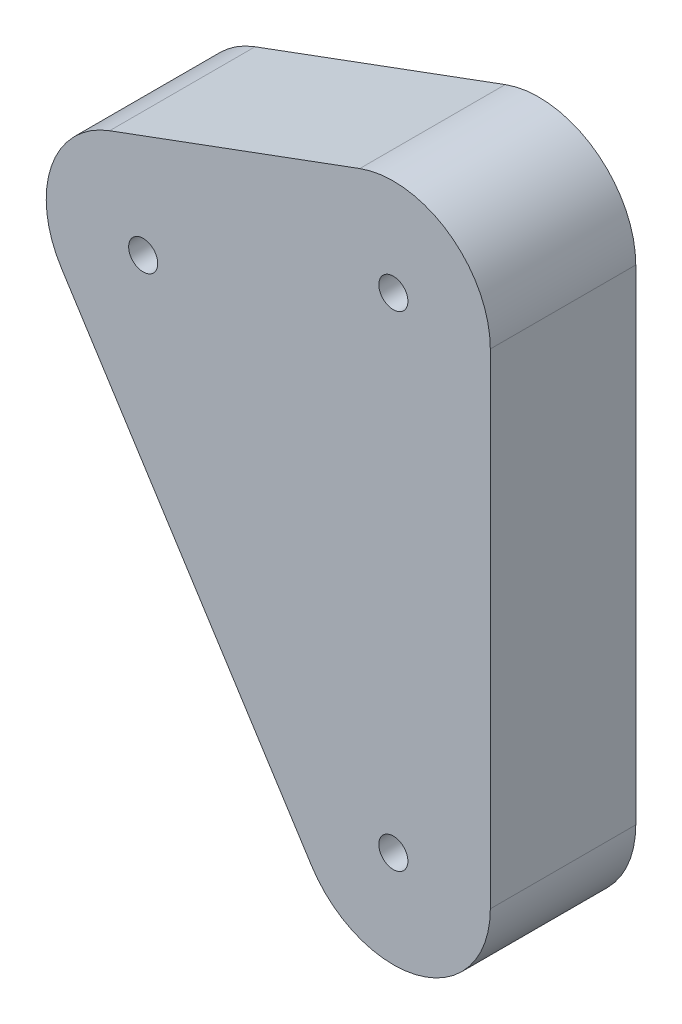
ISO-10303-21;
HEADER;
FILE_DESCRIPTION(('STEP AP214'),'2;1');
FILE_NAME('part.step','',(''),(''),'','','');
FILE_SCHEMA(('AUTOMOTIVE_DESIGN { 1 0 10303 214 1 1 1 1 }'));
ENDSEC;
DATA;
#1=APPLICATION_CONTEXT('core data for automotive mechanical design processes');
#2=APPLICATION_PROTOCOL_DEFINITION('international standard','automotive_design',2000,#1);
#3=PRODUCT_CONTEXT('',#1,'mechanical');
#4=PRODUCT('Part','Part','',(#3));
#5=PRODUCT_RELATED_PRODUCT_CATEGORY('part','',(#4));
#6=PRODUCT_DEFINITION_FORMATION('','',#4);
#7=PRODUCT_DEFINITION_CONTEXT('part definition',#1,'design');
#8=PRODUCT_DEFINITION('design','',#6,#7);
#9=PRODUCT_DEFINITION_SHAPE('','',#8);
#10=(LENGTH_UNIT() NAMED_UNIT(*) SI_UNIT(.MILLI.,.METRE.));
#11=(NAMED_UNIT(*) PLANE_ANGLE_UNIT() SI_UNIT($,.RADIAN.));
#12=(NAMED_UNIT(*) SI_UNIT($,.STERADIAN.) SOLID_ANGLE_UNIT());
#13=UNCERTAINTY_MEASURE_WITH_UNIT(LENGTH_MEASURE(1.E-05),#10,'distance_accuracy_value','');
#14=(GEOMETRIC_REPRESENTATION_CONTEXT(3) GLOBAL_UNCERTAINTY_ASSIGNED_CONTEXT((#13)) GLOBAL_UNIT_ASSIGNED_CONTEXT((#10,
#11,#12)) REPRESENTATION_CONTEXT('',''));
#15=CARTESIAN_POINT('',(0.,0.,0.));
#16=DIRECTION('',(0.,0.,1.));
#17=DIRECTION('',(1.,0.,0.));
#18=AXIS2_PLACEMENT_3D('',#15,#16,#17);
#19=CARTESIAN_POINT('',(0.,50.,15.));
#20=DIRECTION('',(0.,0.,1.));
#21=DIRECTION('',(1.,0.,0.));
#22=AXIS2_PLACEMENT_3D('',#19,#20,#21);
#23=PLANE('',#22);
#24=CARTESIAN_POINT('',(0.,50.,15.));
#25=DIRECTION('',(0.,0.,1.));
#26=DIRECTION('',(1.,0.,0.));
#27=AXIS2_PLACEMENT_3D('',#24,#25,#26);
#28=CIRCLE('',#27,1.5);
#29=CARTESIAN_POINT('',(1.5,50.,15.));
#30=VERTEX_POINT('',#29);
#31=EDGE_CURVE('E188',#30,#30,#28,.T.);
#32=ORIENTED_EDGE('',*,*,#31,.F.);
#33=EDGE_LOOP('',(#32));
#34=FACE_BOUND('',#33,.T.);
#35=CARTESIAN_POINT('',(0.,50.,15.));
#36=DIRECTION('',(0.,0.,1.));
#37=DIRECTION('',(1.,0.,0.));
#38=AXIS2_PLACEMENT_3D('',#35,#36,#37);
#39=CIRCLE('',#38,10.);
#40=CARTESIAN_POINT('',(10.,50.,15.));
#41=VERTEX_POINT('',#40);
#42=CARTESIAN_POINT('',(-3.46272727272727,59.3813389148197,15.));
#43=VERTEX_POINT('',#42);
#44=EDGE_CURVE('E133',#41,#43,#39,.T.);
#45=ORIENTED_EDGE('',*,*,#44,.T.);
#46=DIRECTION('',(-0.938133891481972,-0.346272727272727,0.));
#47=VECTOR('',#46,1.);
#48=CARTESIAN_POINT('',(-29.2614092884815,49.8588389148197,15.));
#49=LINE('',#48,#47);
#50=CARTESIAN_POINT('',(-29.2614092884815,49.8588389148197,15.));
#51=VERTEX_POINT('',#50);
#52=EDGE_CURVE('E91',#43,#51,#49,.T.);
#53=ORIENTED_EDGE('',*,*,#52,.T.);
#54=CARTESIAN_POINT('',(-25.7986820157542,40.4775,15.));
#55=DIRECTION('',(0.,0.,1.));
#56=DIRECTION('',(1.,0.,0.));
#57=AXIS2_PLACEMENT_3D('',#54,#55,#56);
#58=CIRCLE('',#57,10.);
#59=CARTESIAN_POINT('',(-34.2314945157542,35.1027745800512,15.));
#60=VERTEX_POINT('',#59);
#61=EDGE_CURVE('E104',#51,#60,#58,.T.);
#62=ORIENTED_EDGE('',*,*,#61,.T.);
#63=DIRECTION('',(0.537472541994879,-0.84328125,0.));
#64=VECTOR('',#63,1.);
#65=CARTESIAN_POINT('',(-8.4328125,-5.3747254199488,15.));
#66=LINE('',#65,#64);
#67=CARTESIAN_POINT('',(-8.4328125,-5.3747254199488,15.));
#68=VERTEX_POINT('',#67);
#69=EDGE_CURVE('E98',#60,#68,#66,.T.);
#70=ORIENTED_EDGE('',*,*,#69,.T.);
#71=CARTESIAN_POINT('',(0.,0.,15.));
#72=DIRECTION('',(0.,0.,1.));
#73=DIRECTION('',(1.,0.,0.));
#74=AXIS2_PLACEMENT_3D('',#71,#72,#73);
#75=CIRCLE('',#74,10.);
#76=CARTESIAN_POINT('',(10.,0.,15.));
#77=VERTEX_POINT('',#76);
#78=EDGE_CURVE('E102',#68,#77,#75,.T.);
#79=ORIENTED_EDGE('',*,*,#78,.T.);
#80=DIRECTION('',(0.,1.,0.));
#81=VECTOR('',#80,1.);
#82=CARTESIAN_POINT('',(10.,50.,15.));
#83=LINE('',#82,#81);
#84=EDGE_CURVE('E54',#77,#41,#83,.T.);
#85=ORIENTED_EDGE('',*,*,#84,.T.);
#86=EDGE_LOOP('',(#45,#53,#62,#70,#79,#85));
#87=FACE_BOUND('',#86,.T.);
#88=CARTESIAN_POINT('',(-25.7986820157542,40.4775,15.));
#89=DIRECTION('',(0.,0.,1.));
#90=DIRECTION('',(1.,0.,0.));
#91=AXIS2_PLACEMENT_3D('',#88,#89,#90);
#92=CIRCLE('',#91,1.5);
#93=CARTESIAN_POINT('',(-24.2986820157542,40.4775,15.));
#94=VERTEX_POINT('',#93);
#95=EDGE_CURVE('E126',#94,#94,#92,.T.);
#96=ORIENTED_EDGE('',*,*,#95,.F.);
#97=EDGE_LOOP('',(#96));
#98=FACE_BOUND('',#97,.T.);
#99=CARTESIAN_POINT('',(0.,0.,15.));
#100=DIRECTION('',(0.,0.,1.));
#101=DIRECTION('',(1.,0.,0.));
#102=AXIS2_PLACEMENT_3D('',#99,#100,#101);
#103=CIRCLE('',#102,1.5);
#104=CARTESIAN_POINT('',(1.5,0.,15.));
#105=VERTEX_POINT('',#104);
#106=EDGE_CURVE('E179',#105,#105,#103,.T.);
#107=ORIENTED_EDGE('',*,*,#106,.F.);
#108=EDGE_LOOP('',(#107));
#109=FACE_BOUND('',#108,.T.);
#110=ADVANCED_FACE('F37',(#34,#87,#98,#109),#23,.T.);
#111=CARTESIAN_POINT('',(0.,50.,0.));
#112=DIRECTION('',(0.,0.,1.));
#113=DIRECTION('',(1.,0.,0.));
#114=AXIS2_PLACEMENT_3D('',#111,#112,#113);
#115=PLANE('',#114);
#116=CARTESIAN_POINT('',(0.,50.,0.));
#117=DIRECTION('',(0.,0.,1.));
#118=DIRECTION('',(1.,0.,0.));
#119=AXIS2_PLACEMENT_3D('',#116,#117,#118);
#120=CIRCLE('',#119,10.);
#121=CARTESIAN_POINT('',(10.,50.,0.));
#122=VERTEX_POINT('',#121);
#123=CARTESIAN_POINT('',(-3.46272727272727,59.3813389148197,0.));
#124=VERTEX_POINT('',#123);
#125=EDGE_CURVE('E122',#122,#124,#120,.T.);
#126=ORIENTED_EDGE('',*,*,#125,.F.);
#127=DIRECTION('',(0.,1.,0.));
#128=VECTOR('',#127,1.);
#129=CARTESIAN_POINT('',(10.,50.,0.));
#130=LINE('',#129,#128);
#131=CARTESIAN_POINT('',(10.,0.,0.));
#132=VERTEX_POINT('',#131);
#133=EDGE_CURVE('E83',#132,#122,#130,.T.);
#134=ORIENTED_EDGE('',*,*,#133,.F.);
#135=CARTESIAN_POINT('',(0.,0.,0.));
#136=DIRECTION('',(0.,0.,1.));
#137=DIRECTION('',(1.,0.,0.));
#138=AXIS2_PLACEMENT_3D('',#135,#136,#137);
#139=CIRCLE('',#138,10.);
#140=CARTESIAN_POINT('',(-8.4328125,-5.3747254199488,0.));
#141=VERTEX_POINT('',#140);
#142=EDGE_CURVE('E77',#141,#132,#139,.T.);
#143=ORIENTED_EDGE('',*,*,#142,.F.);
#144=DIRECTION('',(0.537472541994879,-0.84328125,0.));
#145=VECTOR('',#144,1.);
#146=CARTESIAN_POINT('',(-8.4328125,-5.3747254199488,0.));
#147=LINE('',#146,#145);
#148=CARTESIAN_POINT('',(-34.2314945157542,35.1027745800512,0.));
#149=VERTEX_POINT('',#148);
#150=EDGE_CURVE('E112',#149,#141,#147,.T.);
#151=ORIENTED_EDGE('',*,*,#150,.F.);
#152=CARTESIAN_POINT('',(-25.7986820157542,40.4775,0.));
#153=DIRECTION('',(0.,0.,1.));
#154=DIRECTION('',(1.,0.,0.));
#155=AXIS2_PLACEMENT_3D('',#152,#153,#154);
#156=CIRCLE('',#155,10.);
#157=CARTESIAN_POINT('',(-29.2614092884815,49.8588389148197,0.));
#158=VERTEX_POINT('',#157);
#159=EDGE_CURVE('E128',#158,#149,#156,.T.);
#160=ORIENTED_EDGE('',*,*,#159,.F.);
#161=DIRECTION('',(-0.938133891481972,-0.346272727272727,0.));
#162=VECTOR('',#161,1.);
#163=CARTESIAN_POINT('',(-29.2614092884815,49.8588389148197,0.));
#164=LINE('',#163,#162);
#165=EDGE_CURVE('E125',#124,#158,#164,.T.);
#166=ORIENTED_EDGE('',*,*,#165,.F.);
#167=EDGE_LOOP('',(#126,#134,#143,#151,#160,#166));
#168=FACE_BOUND('',#167,.T.);
#169=CARTESIAN_POINT('',(-25.7986820157542,40.4775,0.));
#170=DIRECTION('',(0.,0.,1.));
#171=DIRECTION('',(1.,0.,0.));
#172=AXIS2_PLACEMENT_3D('',#169,#170,#171);
#173=CIRCLE('',#172,1.5);
#174=CARTESIAN_POINT('',(-24.2986820157542,40.4775,0.));
#175=VERTEX_POINT('',#174);
#176=EDGE_CURVE('E191',#175,#175,#173,.T.);
#177=ORIENTED_EDGE('',*,*,#176,.T.);
#178=EDGE_LOOP('',(#177));
#179=FACE_BOUND('',#178,.T.);
#180=CARTESIAN_POINT('',(0.,50.,0.));
#181=DIRECTION('',(0.,0.,1.));
#182=DIRECTION('',(1.,0.,0.));
#183=AXIS2_PLACEMENT_3D('',#180,#181,#182);
#184=CIRCLE('',#183,1.5);
#185=CARTESIAN_POINT('',(1.5,50.,0.));
#186=VERTEX_POINT('',#185);
#187=EDGE_CURVE('E185',#186,#186,#184,.T.);
#188=ORIENTED_EDGE('',*,*,#187,.T.);
#189=EDGE_LOOP('',(#188));
#190=FACE_BOUND('',#189,.T.);
#191=CARTESIAN_POINT('',(0.,0.,0.));
#192=DIRECTION('',(0.,0.,1.));
#193=DIRECTION('',(1.,0.,0.));
#194=AXIS2_PLACEMENT_3D('',#191,#192,#193);
#195=CIRCLE('',#194,1.5);
#196=CARTESIAN_POINT('',(1.5,0.,0.));
#197=VERTEX_POINT('',#196);
#198=EDGE_CURVE('E182',#197,#197,#195,.T.);
#199=ORIENTED_EDGE('',*,*,#198,.T.);
#200=EDGE_LOOP('',(#199));
#201=FACE_BOUND('',#200,.T.);
#202=ADVANCED_FACE('F142',(#168,#179,#190,#201),#115,.F.);
#203=CARTESIAN_POINT('',(0.,50.,15.));
#204=DIRECTION('',(0.,0.,-1.));
#205=DIRECTION('',(-1.,0.,0.));
#206=AXIS2_PLACEMENT_3D('',#203,#204,#205);
#207=CYLINDRICAL_SURFACE('',#206,10.);
#208=ORIENTED_EDGE('',*,*,#125,.T.);
#209=DIRECTION('',(0.,0.,-1.));
#210=VECTOR('',#209,1.);
#211=CARTESIAN_POINT('',(-3.46272727272727,59.3813389148197,15.));
#212=LINE('',#211,#210);
#213=EDGE_CURVE('E11',#43,#124,#212,.T.);
#214=ORIENTED_EDGE('',*,*,#213,.F.);
#215=ORIENTED_EDGE('',*,*,#44,.F.);
#216=DIRECTION('',(0.,0.,-1.));
#217=VECTOR('',#216,1.);
#218=CARTESIAN_POINT('',(10.,50.,15.));
#219=LINE('',#218,#217);
#220=EDGE_CURVE('E118',#41,#122,#219,.T.);
#221=ORIENTED_EDGE('',*,*,#220,.T.);
#222=EDGE_LOOP('',(#208,#214,#215,#221));
#223=FACE_BOUND('',#222,.T.);
#224=ADVANCED_FACE('F39',(#223),#207,.T.);
#225=CARTESIAN_POINT('',(-29.2614092884815,49.8588389148197,15.));
#226=DIRECTION('',(0.346272727272727,-0.938133891481972,0.));
#227=DIRECTION('',(0.938133891481972,0.346272727272727,0.));
#228=AXIS2_PLACEMENT_3D('',#225,#226,#227);
#229=PLANE('',#228);
#230=ORIENTED_EDGE('',*,*,#165,.T.);
#231=DIRECTION('',(0.,0.,-1.));
#232=VECTOR('',#231,1.);
#233=CARTESIAN_POINT('',(-29.2614092884815,49.8588389148197,15.));
#234=LINE('',#233,#232);
#235=EDGE_CURVE('E46',#51,#158,#234,.T.);
#236=ORIENTED_EDGE('',*,*,#235,.F.);
#237=ORIENTED_EDGE('',*,*,#52,.F.);
#238=ORIENTED_EDGE('',*,*,#213,.T.);
#239=EDGE_LOOP('',(#230,#236,#237,#238));
#240=FACE_BOUND('',#239,.T.);
#241=ADVANCED_FACE('F241',(#240),#229,.F.);
#242=CARTESIAN_POINT('',(-25.7986820157542,40.4775,15.));
#243=DIRECTION('',(0.,0.,-1.));
#244=DIRECTION('',(-1.,0.,0.));
#245=AXIS2_PLACEMENT_3D('',#242,#243,#244);
#246=CYLINDRICAL_SURFACE('',#245,10.);
#247=ORIENTED_EDGE('',*,*,#159,.T.);
#248=DIRECTION('',(0.,0.,-1.));
#249=VECTOR('',#248,1.);
#250=CARTESIAN_POINT('',(-34.2314945157542,35.1027745800512,15.));
#251=LINE('',#250,#249);
#252=EDGE_CURVE('E113',#60,#149,#251,.T.);
#253=ORIENTED_EDGE('',*,*,#252,.F.);
#254=ORIENTED_EDGE('',*,*,#61,.F.);
#255=ORIENTED_EDGE('',*,*,#235,.T.);
#256=EDGE_LOOP('',(#247,#253,#254,#255));
#257=FACE_BOUND('',#256,.T.);
#258=ADVANCED_FACE('F139',(#257),#246,.T.);
#259=CARTESIAN_POINT('',(-8.4328125,-5.3747254199488,15.));
#260=DIRECTION('',(0.84328125,0.537472541994879,0.));
#261=DIRECTION('',(-0.537472541994879,0.84328125,0.));
#262=AXIS2_PLACEMENT_3D('',#259,#260,#261);
#263=PLANE('',#262);
#264=ORIENTED_EDGE('',*,*,#150,.T.);
#265=DIRECTION('',(0.,0.,-1.));
#266=VECTOR('',#265,1.);
#267=CARTESIAN_POINT('',(-8.4328125,-5.3747254199488,15.));
#268=LINE('',#267,#266);
#269=EDGE_CURVE('E109',#68,#141,#268,.T.);
#270=ORIENTED_EDGE('',*,*,#269,.F.);
#271=ORIENTED_EDGE('',*,*,#69,.F.);
#272=ORIENTED_EDGE('',*,*,#252,.T.);
#273=EDGE_LOOP('',(#264,#270,#271,#272));
#274=FACE_BOUND('',#273,.T.);
#275=ADVANCED_FACE('F110',(#274),#263,.F.);
#276=CARTESIAN_POINT('',(0.,0.,15.));
#277=DIRECTION('',(0.,0.,-1.));
#278=DIRECTION('',(-1.,0.,0.));
#279=AXIS2_PLACEMENT_3D('',#276,#277,#278);
#280=CYLINDRICAL_SURFACE('',#279,10.);
#281=ORIENTED_EDGE('',*,*,#142,.T.);
#282=DIRECTION('',(0.,0.,-1.));
#283=VECTOR('',#282,1.);
#284=CARTESIAN_POINT('',(10.,0.,15.));
#285=LINE('',#284,#283);
#286=EDGE_CURVE('E114',#77,#132,#285,.T.);
#287=ORIENTED_EDGE('',*,*,#286,.F.);
#288=ORIENTED_EDGE('',*,*,#78,.F.);
#289=ORIENTED_EDGE('',*,*,#269,.T.);
#290=EDGE_LOOP('',(#281,#287,#288,#289));
#291=FACE_BOUND('',#290,.T.);
#292=ADVANCED_FACE('F116',(#291),#280,.T.);
#293=CARTESIAN_POINT('',(10.,50.,15.));
#294=DIRECTION('',(-1.,0.,0.));
#295=DIRECTION('',(0.,-1.,0.));
#296=AXIS2_PLACEMENT_3D('',#293,#294,#295);
#297=PLANE('',#296);
#298=ORIENTED_EDGE('',*,*,#133,.T.);
#299=ORIENTED_EDGE('',*,*,#220,.F.);
#300=ORIENTED_EDGE('',*,*,#84,.F.);
#301=ORIENTED_EDGE('',*,*,#286,.T.);
#302=EDGE_LOOP('',(#298,#299,#300,#301));
#303=FACE_BOUND('',#302,.T.);
#304=ADVANCED_FACE('F147',(#303),#297,.F.);
#305=CARTESIAN_POINT('',(-25.7986820157542,40.4775,15.));
#306=DIRECTION('',(0.,0.,-1.));
#307=DIRECTION('',(-1.,0.,0.));
#308=AXIS2_PLACEMENT_3D('',#305,#306,#307);
#309=CYLINDRICAL_SURFACE('',#308,1.5);
#310=ORIENTED_EDGE('',*,*,#95,.T.);
#311=EDGE_LOOP('',(#310));
#312=FACE_BOUND('',#311,.T.);
#313=ORIENTED_EDGE('',*,*,#176,.F.);
#314=EDGE_LOOP('',(#313));
#315=FACE_BOUND('',#314,.T.);
#316=ADVANCED_FACE('F149',(#312,#315),#309,.F.);
#317=CARTESIAN_POINT('',(0.,50.,15.));
#318=DIRECTION('',(0.,0.,-1.));
#319=DIRECTION('',(-1.,0.,0.));
#320=AXIS2_PLACEMENT_3D('',#317,#318,#319);
#321=CYLINDRICAL_SURFACE('',#320,1.5);
#322=ORIENTED_EDGE('',*,*,#31,.T.);
#323=EDGE_LOOP('',(#322));
#324=FACE_BOUND('',#323,.T.);
#325=ORIENTED_EDGE('',*,*,#187,.F.);
#326=EDGE_LOOP('',(#325));
#327=FACE_BOUND('',#326,.T.);
#328=ADVANCED_FACE('F155',(#324,#327),#321,.F.);
#329=CARTESIAN_POINT('',(0.,0.,15.));
#330=DIRECTION('',(0.,0.,-1.));
#331=DIRECTION('',(-1.,0.,0.));
#332=AXIS2_PLACEMENT_3D('',#329,#330,#331);
#333=CYLINDRICAL_SURFACE('',#332,1.5);
#334=ORIENTED_EDGE('',*,*,#106,.T.);
#335=EDGE_LOOP('',(#334));
#336=FACE_BOUND('',#335,.T.);
#337=ORIENTED_EDGE('',*,*,#198,.F.);
#338=EDGE_LOOP('',(#337));
#339=FACE_BOUND('',#338,.T.);
#340=ADVANCED_FACE('F170',(#336,#339),#333,.F.);
#341=CLOSED_SHELL('',(#110,#202,#224,#241,#258,#275,#292,#304,#316,#328,#340));
#342=MANIFOLD_SOLID_BREP('B2',#341);
#343=ADVANCED_BREP_SHAPE_REPRESENTATION('',(#18,#342),#14);
#344=SHAPE_DEFINITION_REPRESENTATION(#9,#343);
ENDSEC;
END-ISO-10303-21;
